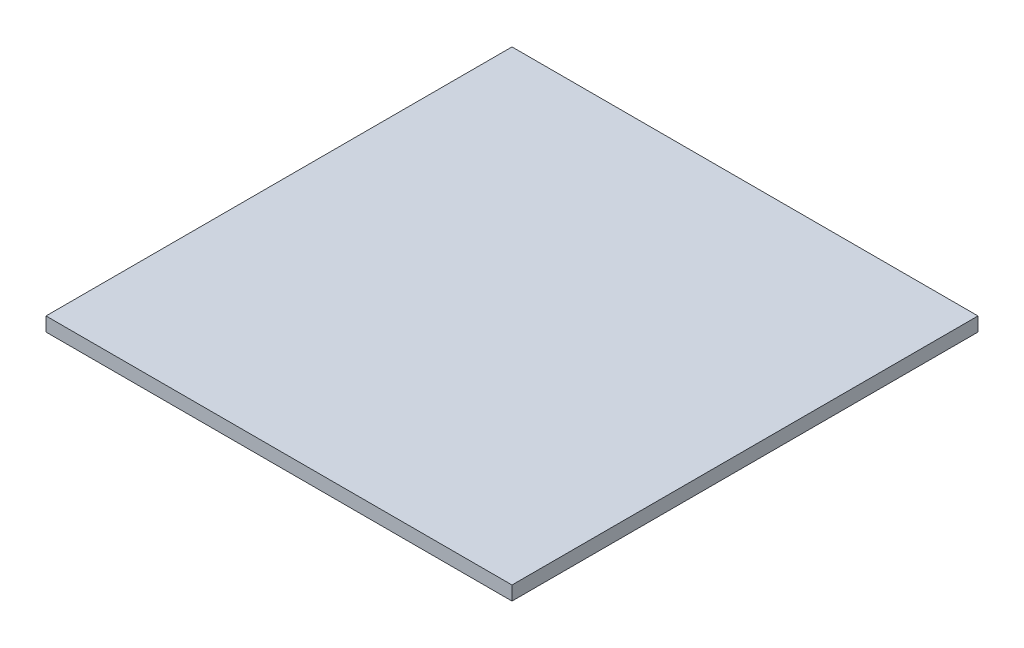
ISO-10303-21;
HEADER;
FILE_DESCRIPTION(('STEP AP214'),'2;1');
FILE_NAME('part.step','',(''),(''),'','','');
FILE_SCHEMA(('AUTOMOTIVE_DESIGN { 1 0 10303 214 1 1 1 1 }'));
ENDSEC;
DATA;
#1=APPLICATION_CONTEXT('core data for automotive mechanical design processes');
#2=APPLICATION_PROTOCOL_DEFINITION('international standard','automotive_design',2000,#1);
#3=PRODUCT_CONTEXT('',#1,'mechanical');
#4=PRODUCT('Part','Part','',(#3));
#5=PRODUCT_RELATED_PRODUCT_CATEGORY('part','',(#4));
#6=PRODUCT_DEFINITION_FORMATION('','',#4);
#7=PRODUCT_DEFINITION_CONTEXT('part definition',#1,'design');
#8=PRODUCT_DEFINITION('design','',#6,#7);
#9=PRODUCT_DEFINITION_SHAPE('','',#8);
#10=(LENGTH_UNIT() NAMED_UNIT(*) SI_UNIT(.MILLI.,.METRE.));
#11=(NAMED_UNIT(*) PLANE_ANGLE_UNIT() SI_UNIT($,.RADIAN.));
#12=(NAMED_UNIT(*) SI_UNIT($,.STERADIAN.) SOLID_ANGLE_UNIT());
#13=UNCERTAINTY_MEASURE_WITH_UNIT(LENGTH_MEASURE(1.E-05),#10,'distance_accuracy_value','');
#14=(GEOMETRIC_REPRESENTATION_CONTEXT(3) GLOBAL_UNCERTAINTY_ASSIGNED_CONTEXT((#13)) GLOBAL_UNIT_ASSIGNED_CONTEXT((#10,
#11,#12)) REPRESENTATION_CONTEXT('',''));
#15=CARTESIAN_POINT('',(0.,0.,0.));
#16=DIRECTION('',(0.,0.,1.));
#17=DIRECTION('',(1.,0.,0.));
#18=AXIS2_PLACEMENT_3D('',#15,#16,#17);
#19=CARTESIAN_POINT('',(-103.4375,3.,-107.1875));
#20=DIRECTION('',(1.,0.,0.));
#21=DIRECTION('',(0.,0.,-1.));
#22=AXIS2_PLACEMENT_3D('',#19,#20,#21);
#23=PLANE('',#22);
#24=DIRECTION('',(0.,0.,1.));
#25=VECTOR('',#24,1.);
#26=CARTESIAN_POINT('',(-103.4375,0.,-107.1875));
#27=LINE('',#26,#25);
#28=CARTESIAN_POINT('',(-103.4375,0.,-107.1875));
#29=VERTEX_POINT('',#28);
#30=CARTESIAN_POINT('',(-103.4375,0.,-7.1875));
#31=VERTEX_POINT('',#30);
#32=EDGE_CURVE('E96',#29,#31,#27,.T.);
#33=ORIENTED_EDGE('',*,*,#32,.T.);
#34=DIRECTION('',(0.,-1.,0.));
#35=VECTOR('',#34,1.);
#36=CARTESIAN_POINT('',(-103.4375,3.,-7.1875));
#37=LINE('',#36,#35);
#38=CARTESIAN_POINT('',(-103.4375,3.,-7.1875));
#39=VERTEX_POINT('',#38);
#40=EDGE_CURVE('E11',#39,#31,#37,.T.);
#41=ORIENTED_EDGE('',*,*,#40,.F.);
#42=DIRECTION('',(0.,0.,1.));
#43=VECTOR('',#42,1.);
#44=CARTESIAN_POINT('',(-103.4375,3.,-107.1875));
#45=LINE('',#44,#43);
#46=CARTESIAN_POINT('',(-103.4375,3.,-107.1875));
#47=VERTEX_POINT('',#46);
#48=EDGE_CURVE('E84',#47,#39,#45,.T.);
#49=ORIENTED_EDGE('',*,*,#48,.F.);
#50=DIRECTION('',(0.,-1.,0.));
#51=VECTOR('',#50,1.);
#52=CARTESIAN_POINT('',(-103.4375,3.,-107.1875));
#53=LINE('',#52,#51);
#54=EDGE_CURVE('E92',#47,#29,#53,.T.);
#55=ORIENTED_EDGE('',*,*,#54,.T.);
#56=EDGE_LOOP('',(#33,#41,#49,#55));
#57=FACE_BOUND('',#56,.T.);
#58=ADVANCED_FACE('F33',(#57),#23,.F.);
#59=CARTESIAN_POINT('',(-103.4375,3.,-7.1875));
#60=DIRECTION('',(0.,0.,-1.));
#61=DIRECTION('',(-1.,0.,0.));
#62=AXIS2_PLACEMENT_3D('',#59,#60,#61);
#63=PLANE('',#62);
#64=DIRECTION('',(1.,0.,0.));
#65=VECTOR('',#64,1.);
#66=CARTESIAN_POINT('',(-103.4375,0.,-7.1875));
#67=LINE('',#66,#65);
#68=CARTESIAN_POINT('',(-3.43750000000001,0.,-7.1875));
#69=VERTEX_POINT('',#68);
#70=EDGE_CURVE('E88',#31,#69,#67,.T.);
#71=ORIENTED_EDGE('',*,*,#70,.T.);
#72=DIRECTION('',(0.,-1.,0.));
#73=VECTOR('',#72,1.);
#74=CARTESIAN_POINT('',(-3.43750000000001,3.,-7.1875));
#75=LINE('',#74,#73);
#76=CARTESIAN_POINT('',(-3.43750000000001,3.,-7.1875));
#77=VERTEX_POINT('',#76);
#78=EDGE_CURVE('E41',#77,#69,#75,.T.);
#79=ORIENTED_EDGE('',*,*,#78,.F.);
#80=DIRECTION('',(1.,0.,0.));
#81=VECTOR('',#80,1.);
#82=CARTESIAN_POINT('',(-103.4375,3.,-7.1875));
#83=LINE('',#82,#81);
#84=EDGE_CURVE('E79',#39,#77,#83,.T.);
#85=ORIENTED_EDGE('',*,*,#84,.F.);
#86=ORIENTED_EDGE('',*,*,#40,.T.);
#87=EDGE_LOOP('',(#71,#79,#85,#86));
#88=FACE_BOUND('',#87,.T.);
#89=ADVANCED_FACE('F87',(#88),#63,.F.);
#90=CARTESIAN_POINT('',(-3.43750000000001,3.,-107.1875));
#91=DIRECTION('',(-1.,0.,0.));
#92=DIRECTION('',(0.,0.,1.));
#93=AXIS2_PLACEMENT_3D('',#90,#91,#92);
#94=PLANE('',#93);
#95=DIRECTION('',(0.,0.,-1.));
#96=VECTOR('',#95,1.);
#97=CARTESIAN_POINT('',(-3.43750000000001,0.,-107.1875));
#98=LINE('',#97,#96);
#99=CARTESIAN_POINT('',(-3.43750000000001,0.,-107.1875));
#100=VERTEX_POINT('',#99);
#101=EDGE_CURVE('E66',#69,#100,#98,.T.);
#102=ORIENTED_EDGE('',*,*,#101,.T.);
#103=DIRECTION('',(0.,-1.,0.));
#104=VECTOR('',#103,1.);
#105=CARTESIAN_POINT('',(-3.43750000000001,3.,-107.1875));
#106=LINE('',#105,#104);
#107=CARTESIAN_POINT('',(-3.43750000000001,3.,-107.1875));
#108=VERTEX_POINT('',#107);
#109=EDGE_CURVE('E89',#108,#100,#106,.T.);
#110=ORIENTED_EDGE('',*,*,#109,.F.);
#111=DIRECTION('',(0.,0.,-1.));
#112=VECTOR('',#111,1.);
#113=CARTESIAN_POINT('',(-3.43750000000001,3.,-107.1875));
#114=LINE('',#113,#112);
#115=EDGE_CURVE('E82',#77,#108,#114,.T.);
#116=ORIENTED_EDGE('',*,*,#115,.F.);
#117=ORIENTED_EDGE('',*,*,#78,.T.);
#118=EDGE_LOOP('',(#102,#110,#116,#117));
#119=FACE_BOUND('',#118,.T.);
#120=ADVANCED_FACE('F90',(#119),#94,.F.);
#121=CARTESIAN_POINT('',(-103.4375,3.,-107.1875));
#122=DIRECTION('',(0.,0.,1.));
#123=DIRECTION('',(1.,0.,0.));
#124=AXIS2_PLACEMENT_3D('',#121,#122,#123);
#125=PLANE('',#124);
#126=DIRECTION('',(-1.,0.,0.));
#127=VECTOR('',#126,1.);
#128=CARTESIAN_POINT('',(-103.4375,0.,-107.1875));
#129=LINE('',#128,#127);
#130=EDGE_CURVE('E72',#100,#29,#129,.T.);
#131=ORIENTED_EDGE('',*,*,#130,.T.);
#132=ORIENTED_EDGE('',*,*,#54,.F.);
#133=DIRECTION('',(-1.,0.,0.));
#134=VECTOR('',#133,1.);
#135=CARTESIAN_POINT('',(-103.4375,3.,-107.1875));
#136=LINE('',#135,#134);
#137=EDGE_CURVE('E49',#108,#47,#136,.T.);
#138=ORIENTED_EDGE('',*,*,#137,.F.);
#139=ORIENTED_EDGE('',*,*,#109,.T.);
#140=EDGE_LOOP('',(#131,#132,#138,#139));
#141=FACE_BOUND('',#140,.T.);
#142=ADVANCED_FACE('F103',(#141),#125,.F.);
#143=CARTESIAN_POINT('',(0.,3.,0.));
#144=DIRECTION('',(0.,1.,0.));
#145=DIRECTION('',(0.,0.,1.));
#146=AXIS2_PLACEMENT_3D('',#143,#144,#145);
#147=PLANE('',#146);
#148=ORIENTED_EDGE('',*,*,#48,.T.);
#149=ORIENTED_EDGE('',*,*,#84,.T.);
#150=ORIENTED_EDGE('',*,*,#115,.T.);
#151=ORIENTED_EDGE('',*,*,#137,.T.);
#152=EDGE_LOOP('',(#148,#149,#150,#151));
#153=FACE_BOUND('',#152,.T.);
#154=ADVANCED_FACE('F80',(#153),#147,.T.);
#155=CARTESIAN_POINT('',(0.,0.,0.));
#156=DIRECTION('',(0.,1.,0.));
#157=DIRECTION('',(0.,0.,1.));
#158=AXIS2_PLACEMENT_3D('',#155,#156,#157);
#159=PLANE('',#158);
#160=ORIENTED_EDGE('',*,*,#32,.F.);
#161=ORIENTED_EDGE('',*,*,#130,.F.);
#162=ORIENTED_EDGE('',*,*,#101,.F.);
#163=ORIENTED_EDGE('',*,*,#70,.F.);
#164=EDGE_LOOP('',(#160,#161,#162,#163));
#165=FACE_BOUND('',#164,.T.);
#166=ADVANCED_FACE('F106',(#165),#159,.F.);
#167=CLOSED_SHELL('',(#58,#89,#120,#142,#154,#166));
#168=MANIFOLD_SOLID_BREP('B2',#167);
#169=ADVANCED_BREP_SHAPE_REPRESENTATION('',(#18,#168),#14);
#170=SHAPE_DEFINITION_REPRESENTATION(#9,#169);
ENDSEC;
END-ISO-10303-21;
